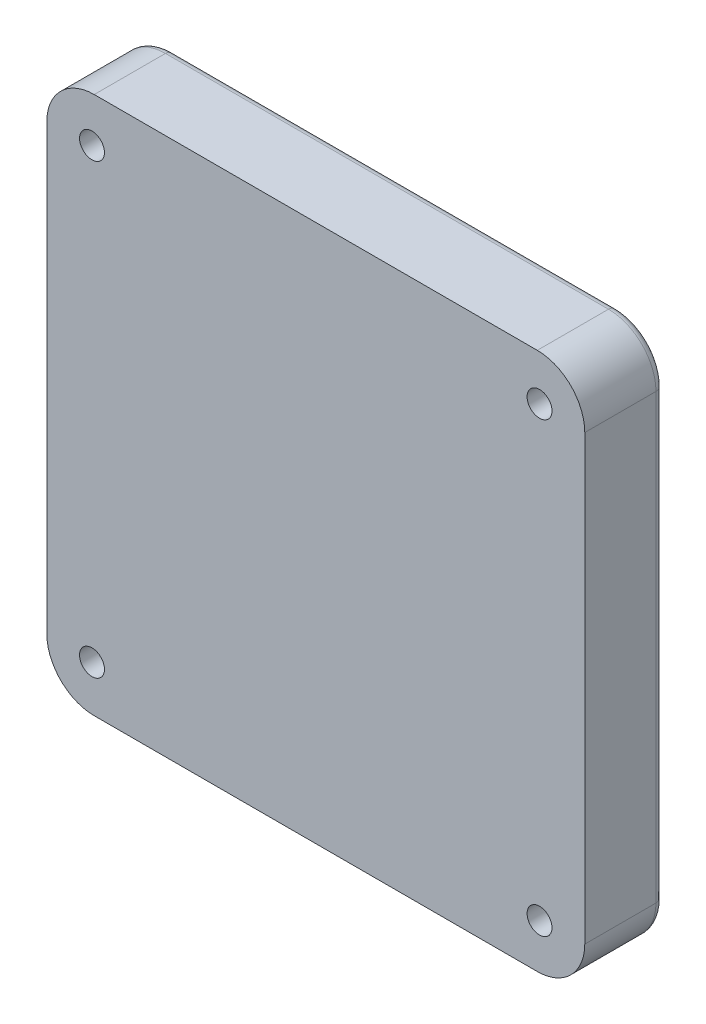
ISO-10303-21;
HEADER;
FILE_DESCRIPTION(('STEP AP214'),'2;1');
FILE_NAME('part.step','',(''),(''),'','','');
FILE_SCHEMA(('AUTOMOTIVE_DESIGN { 1 0 10303 214 1 1 1 1 }'));
ENDSEC;
DATA;
#1=APPLICATION_CONTEXT('core data for automotive mechanical design processes');
#2=APPLICATION_PROTOCOL_DEFINITION('international standard','automotive_design',2000,#1);
#3=PRODUCT_CONTEXT('',#1,'mechanical');
#4=PRODUCT('Part','Part','',(#3));
#5=PRODUCT_RELATED_PRODUCT_CATEGORY('part','',(#4));
#6=PRODUCT_DEFINITION_FORMATION('','',#4);
#7=PRODUCT_DEFINITION_CONTEXT('part definition',#1,'design');
#8=PRODUCT_DEFINITION('design','',#6,#7);
#9=PRODUCT_DEFINITION_SHAPE('','',#8);
#10=(LENGTH_UNIT() NAMED_UNIT(*) SI_UNIT(.MILLI.,.METRE.));
#11=(NAMED_UNIT(*) PLANE_ANGLE_UNIT() SI_UNIT($,.RADIAN.));
#12=(NAMED_UNIT(*) SI_UNIT($,.STERADIAN.) SOLID_ANGLE_UNIT());
#13=UNCERTAINTY_MEASURE_WITH_UNIT(LENGTH_MEASURE(1.E-05),#10,'distance_accuracy_value','');
#14=(GEOMETRIC_REPRESENTATION_CONTEXT(3) GLOBAL_UNCERTAINTY_ASSIGNED_CONTEXT((#13)) GLOBAL_UNIT_ASSIGNED_CONTEXT((#10,
#11,#12)) REPRESENTATION_CONTEXT('',''));
#15=CARTESIAN_POINT('',(0.,0.,0.));
#16=DIRECTION('',(0.,0.,1.));
#17=DIRECTION('',(1.,0.,0.));
#18=AXIS2_PLACEMENT_3D('',#15,#16,#17);
#19=CARTESIAN_POINT('',(117.072792821185,19.2587083204985,-106.995840518768));
#20=DIRECTION('',(0.,0.,1.));
#21=DIRECTION('',(1.,0.,0.));
#22=AXIS2_PLACEMENT_3D('',#19,#20,#21);
#23=PLANE('',#22);
#24=DIRECTION('',(1.,0.,0.));
#25=VECTOR('',#24,1.);
#26=CARTESIAN_POINT('',(117.072792821185,80.2587083204985,-106.995840518768));
#27=LINE('',#26,#25);
#28=CARTESIAN_POINT('',(61.0727928211846,80.2587083204985,-106.995840518768));
#29=VERTEX_POINT('',#28);
#30=CARTESIAN_POINT('',(117.072792821185,80.2587083204985,-106.995840518768));
#31=VERTEX_POINT('',#30);
#32=EDGE_CURVE('E197',#29,#31,#27,.T.);
#33=ORIENTED_EDGE('',*,*,#32,.T.);
#34=CARTESIAN_POINT('',(117.072792821185,75.2587083204985,-106.995840518768));
#35=DIRECTION('',(0.,0.,1.));
#36=DIRECTION('',(1.,0.,0.));
#37=AXIS2_PLACEMENT_3D('',#34,#35,#36);
#38=CIRCLE('',#37,5.);
#39=CARTESIAN_POINT('',(122.072792821185,75.2587083204985,-106.995840518768));
#40=VERTEX_POINT('',#39);
#41=EDGE_CURVE('E199',#31,#40,#38,.F.);
#42=ORIENTED_EDGE('',*,*,#41,.T.);
#43=DIRECTION('',(0.,-1.,0.));
#44=VECTOR('',#43,1.);
#45=CARTESIAN_POINT('',(122.072792821185,19.2587083204985,-106.995840518768));
#46=LINE('',#45,#44);
#47=CARTESIAN_POINT('',(122.072792821185,19.2587083204985,-106.995840518768));
#48=VERTEX_POINT('',#47);
#49=EDGE_CURVE('E136',#40,#48,#46,.T.);
#50=ORIENTED_EDGE('',*,*,#49,.T.);
#51=CARTESIAN_POINT('',(117.072792821185,19.2587083204985,-106.995840518768));
#52=DIRECTION('',(0.,0.,1.));
#53=DIRECTION('',(1.,0.,0.));
#54=AXIS2_PLACEMENT_3D('',#51,#52,#53);
#55=CIRCLE('',#54,5.);
#56=CARTESIAN_POINT('',(117.072792821185,14.2587083204985,-106.995840518768));
#57=VERTEX_POINT('',#56);
#58=EDGE_CURVE('E187',#48,#57,#55,.F.);
#59=ORIENTED_EDGE('',*,*,#58,.T.);
#60=DIRECTION('',(-1.,0.,0.));
#61=VECTOR('',#60,1.);
#62=CARTESIAN_POINT('',(117.072792821185,14.2587083204985,-106.995840518768));
#63=LINE('',#62,#61);
#64=CARTESIAN_POINT('',(61.0727928211846,14.2587083204985,-106.995840518768));
#65=VERTEX_POINT('',#64);
#66=EDGE_CURVE('E189',#57,#65,#63,.T.);
#67=ORIENTED_EDGE('',*,*,#66,.T.);
#68=CARTESIAN_POINT('',(61.0727928211845,19.2587083204985,-106.995840518768));
#69=DIRECTION('',(0.,0.,1.));
#70=DIRECTION('',(1.,0.,0.));
#71=AXIS2_PLACEMENT_3D('',#68,#69,#70);
#72=CIRCLE('',#71,5.);
#73=CARTESIAN_POINT('',(56.0727928211845,19.2587083204985,-106.995840518768));
#74=VERTEX_POINT('',#73);
#75=EDGE_CURVE('E191',#65,#74,#72,.F.);
#76=ORIENTED_EDGE('',*,*,#75,.T.);
#77=DIRECTION('',(0.,1.,0.));
#78=VECTOR('',#77,1.);
#79=CARTESIAN_POINT('',(56.0727928211845,19.2587083204985,-106.995840518768));
#80=LINE('',#79,#78);
#81=CARTESIAN_POINT('',(56.0727928211845,75.2587083204985,-106.995840518768));
#82=VERTEX_POINT('',#81);
#83=EDGE_CURVE('E193',#74,#82,#80,.T.);
#84=ORIENTED_EDGE('',*,*,#83,.T.);
#85=CARTESIAN_POINT('',(61.0727928211845,75.2587083204985,-106.995840518768));
#86=DIRECTION('',(0.,0.,1.));
#87=DIRECTION('',(1.,0.,0.));
#88=AXIS2_PLACEMENT_3D('',#85,#86,#87);
#89=CIRCLE('',#88,5.);
#90=EDGE_CURVE('E195',#82,#29,#89,.F.);
#91=ORIENTED_EDGE('',*,*,#90,.T.);
#92=EDGE_LOOP('',(#33,#42,#50,#59,#67,#76,#84,#91));
#93=FACE_BOUND('',#92,.T.);
#94=CARTESIAN_POINT('',(117.357064068646,75.5429795679604,-106.995840518768));
#95=DIRECTION('',(0.,0.,-1.));
#96=DIRECTION('',(-1.,0.,0.));
#97=AXIS2_PLACEMENT_3D('',#94,#95,#96);
#98=CIRCLE('',#97,1.57499999999999);
#99=CARTESIAN_POINT('',(115.782064068646,75.5429795679604,-106.995840518768));
#100=VERTEX_POINT('',#99);
#101=EDGE_CURVE('E152',#100,#100,#98,.T.);
#102=ORIENTED_EDGE('',*,*,#101,.F.);
#103=EDGE_LOOP('',(#102));
#104=FACE_BOUND('',#103,.T.);
#105=CARTESIAN_POINT('',(60.7885215737225,75.5429795679611,-106.995840518768));
#106=DIRECTION('',(0.,0.,-1.));
#107=DIRECTION('',(-1.,0.,0.));
#108=AXIS2_PLACEMENT_3D('',#105,#106,#107);
#109=CIRCLE('',#108,1.57499999999999);
#110=CARTESIAN_POINT('',(59.2135215737225,75.5429795679611,-106.995840518768));
#111=VERTEX_POINT('',#110);
#112=EDGE_CURVE('E256',#111,#111,#109,.T.);
#113=ORIENTED_EDGE('',*,*,#112,.F.);
#114=EDGE_LOOP('',(#113));
#115=FACE_BOUND('',#114,.T.);
#116=CARTESIAN_POINT('',(60.788521573722,18.9744370730372,-106.995840518768));
#117=DIRECTION('',(0.,0.,-1.));
#118=DIRECTION('',(-1.,0.,0.));
#119=AXIS2_PLACEMENT_3D('',#116,#117,#118);
#120=CIRCLE('',#119,1.57499999999999);
#121=CARTESIAN_POINT('',(59.213521573722,18.9744370730372,-106.995840518768));
#122=VERTEX_POINT('',#121);
#123=EDGE_CURVE('E250',#122,#122,#120,.T.);
#124=ORIENTED_EDGE('',*,*,#123,.F.);
#125=EDGE_LOOP('',(#124));
#126=FACE_BOUND('',#125,.T.);
#127=CARTESIAN_POINT('',(117.357064068646,18.9744370730369,-106.995840518768));
#128=DIRECTION('',(0.,0.,-1.));
#129=DIRECTION('',(-1.,0.,0.));
#130=AXIS2_PLACEMENT_3D('',#127,#128,#129);
#131=CIRCLE('',#130,1.57499999999998);
#132=CARTESIAN_POINT('',(115.782064068646,18.9744370730369,-106.995840518768));
#133=VERTEX_POINT('',#132);
#134=EDGE_CURVE('E242',#133,#133,#131,.T.);
#135=ORIENTED_EDGE('',*,*,#134,.F.);
#136=EDGE_LOOP('',(#135));
#137=FACE_BOUND('',#136,.T.);
#138=ADVANCED_FACE('F41',(#93,#104,#115,#126,#137),#23,.F.);
#139=CARTESIAN_POINT('',(117.072792821185,19.2587083204985,-96.9958405187684));
#140=DIRECTION('',(0.,0.,1.));
#141=DIRECTION('',(1.,0.,0.));
#142=AXIS2_PLACEMENT_3D('',#139,#140,#141);
#143=PLANE('',#142);
#144=CARTESIAN_POINT('',(60.788521573722,18.9744370730372,-96.9958405187684));
#145=DIRECTION('',(0.,0.,-1.));
#146=DIRECTION('',(-1.,0.,0.));
#147=AXIS2_PLACEMENT_3D('',#144,#145,#146);
#148=CIRCLE('',#147,1.57499999999999);
#149=CARTESIAN_POINT('',(59.213521573722,18.9744370730372,-96.9958405187684));
#150=VERTEX_POINT('',#149);
#151=EDGE_CURVE('E247',#150,#150,#148,.T.);
#152=ORIENTED_EDGE('',*,*,#151,.T.);
#153=EDGE_LOOP('',(#152));
#154=FACE_BOUND('',#153,.T.);
#155=CARTESIAN_POINT('',(117.357064068646,75.5429795679604,-96.9958405187684));
#156=DIRECTION('',(0.,0.,-1.));
#157=DIRECTION('',(-1.,0.,0.));
#158=AXIS2_PLACEMENT_3D('',#155,#156,#157);
#159=CIRCLE('',#158,1.57499999999999);
#160=CARTESIAN_POINT('',(115.782064068646,75.5429795679604,-96.9958405187684));
#161=VERTEX_POINT('',#160);
#162=EDGE_CURVE('E155',#161,#161,#159,.T.);
#163=ORIENTED_EDGE('',*,*,#162,.T.);
#164=EDGE_LOOP('',(#163));
#165=FACE_BOUND('',#164,.T.);
#166=CARTESIAN_POINT('',(117.072792821185,19.2587083204985,-96.9958405187684));
#167=DIRECTION('',(0.,0.,-1.));
#168=DIRECTION('',(1.,0.,0.));
#169=AXIS2_PLACEMENT_3D('',#166,#167,#168);
#170=CIRCLE('',#169,6.);
#171=CARTESIAN_POINT('',(123.072792821185,19.2587083204985,-96.9958405187684));
#172=VERTEX_POINT('',#171);
#173=CARTESIAN_POINT('',(117.072792821185,13.2587083204985,-96.9958405187684));
#174=VERTEX_POINT('',#173);
#175=EDGE_CURVE('E144',#172,#174,#170,.T.);
#176=ORIENTED_EDGE('',*,*,#175,.F.);
#177=DIRECTION('',(0.,-1.,0.));
#178=VECTOR('',#177,1.);
#179=CARTESIAN_POINT('',(123.072792821185,19.2587083204985,-96.9958405187684));
#180=LINE('',#179,#178);
#181=CARTESIAN_POINT('',(123.072792821185,75.2587083204984,-96.9958405187684));
#182=VERTEX_POINT('',#181);
#183=EDGE_CURVE('E172',#182,#172,#180,.T.);
#184=ORIENTED_EDGE('',*,*,#183,.F.);
#185=CARTESIAN_POINT('',(117.072792821185,75.2587083204985,-96.9958405187684));
#186=DIRECTION('',(0.,0.,-1.));
#187=DIRECTION('',(-1.,0.,0.));
#188=AXIS2_PLACEMENT_3D('',#185,#186,#187);
#189=CIRCLE('',#188,6.);
#190=CARTESIAN_POINT('',(117.072792821185,81.2587083204985,-96.9958405187684));
#191=VERTEX_POINT('',#190);
#192=EDGE_CURVE('E169',#191,#182,#189,.T.);
#193=ORIENTED_EDGE('',*,*,#192,.F.);
#194=DIRECTION('',(1.,0.,0.));
#195=VECTOR('',#194,1.);
#196=CARTESIAN_POINT('',(61.0727928211846,81.2587083204985,-96.9958405187684));
#197=LINE('',#196,#195);
#198=CARTESIAN_POINT('',(61.0727928211846,81.2587083204985,-96.9958405187684));
#199=VERTEX_POINT('',#198);
#200=EDGE_CURVE('E166',#199,#191,#197,.T.);
#201=ORIENTED_EDGE('',*,*,#200,.F.);
#202=CARTESIAN_POINT('',(61.0727928211845,75.2587083204985,-96.9958405187684));
#203=DIRECTION('',(0.,0.,-1.));
#204=DIRECTION('',(-1.,0.,0.));
#205=AXIS2_PLACEMENT_3D('',#202,#203,#204);
#206=CIRCLE('',#205,6.);
#207=CARTESIAN_POINT('',(55.0727928211845,75.2587083204985,-96.9958405187684));
#208=VERTEX_POINT('',#207);
#209=EDGE_CURVE('E163',#208,#199,#206,.T.);
#210=ORIENTED_EDGE('',*,*,#209,.F.);
#211=DIRECTION('',(0.,1.,0.));
#212=VECTOR('',#211,1.);
#213=CARTESIAN_POINT('',(55.0727928211845,19.2587083204985,-96.9958405187684));
#214=LINE('',#213,#212);
#215=CARTESIAN_POINT('',(55.0727928211845,19.2587083204985,-96.9958405187684));
#216=VERTEX_POINT('',#215);
#217=EDGE_CURVE('E160',#216,#208,#214,.T.);
#218=ORIENTED_EDGE('',*,*,#217,.F.);
#219=CARTESIAN_POINT('',(61.0727928211845,19.2587083204985,-96.9958405187684));
#220=DIRECTION('',(0.,0.,-1.));
#221=DIRECTION('',(-1.,0.,0.));
#222=AXIS2_PLACEMENT_3D('',#219,#220,#221);
#223=CIRCLE('',#222,6.);
#224=CARTESIAN_POINT('',(61.0727928211846,13.2587083204985,-96.9958405187684));
#225=VERTEX_POINT('',#224);
#226=EDGE_CURVE('E147',#225,#216,#223,.T.);
#227=ORIENTED_EDGE('',*,*,#226,.F.);
#228=DIRECTION('',(-1.,0.,0.));
#229=VECTOR('',#228,1.);
#230=CARTESIAN_POINT('',(61.0727928211846,13.2587083204985,-96.9958405187684));
#231=LINE('',#230,#229);
#232=EDGE_CURVE('E132',#174,#225,#231,.T.);
#233=ORIENTED_EDGE('',*,*,#232,.F.);
#234=EDGE_LOOP('',(#176,#184,#193,#201,#210,#218,#227,#233));
#235=FACE_BOUND('',#234,.T.);
#236=CARTESIAN_POINT('',(60.7885215737225,75.5429795679611,-96.9958405187684));
#237=DIRECTION('',(0.,0.,-1.));
#238=DIRECTION('',(-1.,0.,0.));
#239=AXIS2_PLACEMENT_3D('',#236,#237,#238);
#240=CIRCLE('',#239,1.57499999999999);
#241=CARTESIAN_POINT('',(59.2135215737225,75.5429795679611,-96.9958405187684));
#242=VERTEX_POINT('',#241);
#243=EDGE_CURVE('E253',#242,#242,#240,.T.);
#244=ORIENTED_EDGE('',*,*,#243,.T.);
#245=EDGE_LOOP('',(#244));
#246=FACE_BOUND('',#245,.T.);
#247=CARTESIAN_POINT('',(117.357064068646,18.9744370730369,-96.9958405187684));
#248=DIRECTION('',(0.,0.,-1.));
#249=DIRECTION('',(-1.,0.,0.));
#250=AXIS2_PLACEMENT_3D('',#247,#248,#249);
#251=CIRCLE('',#250,1.57499999999998);
#252=CARTESIAN_POINT('',(115.782064068646,18.9744370730369,-96.9958405187684));
#253=VERTEX_POINT('',#252);
#254=EDGE_CURVE('E236',#253,#253,#251,.T.);
#255=ORIENTED_EDGE('',*,*,#254,.T.);
#256=EDGE_LOOP('',(#255));
#257=FACE_BOUND('',#256,.T.);
#258=ADVANCED_FACE('F141',(#154,#165,#235,#246,#257),#143,.T.);
#259=CARTESIAN_POINT('',(117.072792821185,19.2587083204985,-106.995840518768));
#260=DIRECTION('',(0.,0.,1.));
#261=DIRECTION('',(1.,0.,0.));
#262=AXIS2_PLACEMENT_3D('',#259,#260,#261);
#263=CYLINDRICAL_SURFACE('',#262,6.);
#264=DIRECTION('',(0.,0.,1.));
#265=VECTOR('',#264,1.);
#266=CARTESIAN_POINT('',(117.072792821185,13.2587083204985,-106.995840518768));
#267=LINE('',#266,#265);
#268=CARTESIAN_POINT('',(117.072792821185,13.2587083204985,-105.995840518768));
#269=VERTEX_POINT('',#268);
#270=EDGE_CURVE('E129',#269,#174,#267,.T.);
#271=ORIENTED_EDGE('',*,*,#270,.F.);
#272=CARTESIAN_POINT('',(117.072792821185,19.2587083204985,-105.995840518768));
#273=DIRECTION('',(0.,0.,1.));
#274=DIRECTION('',(1.,0.,0.));
#275=AXIS2_PLACEMENT_3D('',#272,#273,#274);
#276=CIRCLE('',#275,6.);
#277=CARTESIAN_POINT('',(123.072792821185,19.2587083204985,-105.995840518768));
#278=VERTEX_POINT('',#277);
#279=EDGE_CURVE('E50',#269,#278,#276,.T.);
#280=ORIENTED_EDGE('',*,*,#279,.T.);
#281=DIRECTION('',(0.,0.,1.));
#282=VECTOR('',#281,1.);
#283=CARTESIAN_POINT('',(123.072792821185,19.2587083204985,-106.995840518768));
#284=LINE('',#283,#282);
#285=EDGE_CURVE('E150',#278,#172,#284,.T.);
#286=ORIENTED_EDGE('',*,*,#285,.T.);
#287=ORIENTED_EDGE('',*,*,#175,.T.);
#288=EDGE_LOOP('',(#271,#280,#286,#287));
#289=FACE_BOUND('',#288,.T.);
#290=ADVANCED_FACE('F149',(#289),#263,.T.);
#291=CARTESIAN_POINT('',(61.0727928211846,13.2587083204985,-106.995840518768));
#292=DIRECTION('',(0.,1.,0.));
#293=DIRECTION('',(-1.,0.,0.));
#294=AXIS2_PLACEMENT_3D('',#291,#292,#293);
#295=PLANE('',#294);
#296=DIRECTION('',(0.,0.,1.));
#297=VECTOR('',#296,1.);
#298=CARTESIAN_POINT('',(61.0727928211846,13.2587083204985,-106.995840518768));
#299=LINE('',#298,#297);
#300=CARTESIAN_POINT('',(61.0727928211846,13.2587083204985,-105.995840518768));
#301=VERTEX_POINT('',#300);
#302=EDGE_CURVE('E137',#301,#225,#299,.T.);
#303=ORIENTED_EDGE('',*,*,#302,.F.);
#304=DIRECTION('',(-1.,0.,0.));
#305=VECTOR('',#304,1.);
#306=CARTESIAN_POINT('',(61.0727928211846,13.2587083204985,-105.995840518768));
#307=LINE('',#306,#305);
#308=EDGE_CURVE('E65',#301,#269,#307,.F.);
#309=ORIENTED_EDGE('',*,*,#308,.T.);
#310=ORIENTED_EDGE('',*,*,#270,.T.);
#311=ORIENTED_EDGE('',*,*,#232,.T.);
#312=EDGE_LOOP('',(#303,#309,#310,#311));
#313=FACE_BOUND('',#312,.T.);
#314=ADVANCED_FACE('F131',(#313),#295,.F.);
#315=CARTESIAN_POINT('',(61.0727928211845,19.2587083204985,-106.995840518768));
#316=DIRECTION('',(0.,0.,1.));
#317=DIRECTION('',(1.,0.,0.));
#318=AXIS2_PLACEMENT_3D('',#315,#316,#317);
#319=CYLINDRICAL_SURFACE('',#318,6.);
#320=DIRECTION('',(0.,0.,1.));
#321=VECTOR('',#320,1.);
#322=CARTESIAN_POINT('',(55.0727928211845,19.2587083204985,-106.995840518768));
#323=LINE('',#322,#321);
#324=CARTESIAN_POINT('',(55.0727928211845,19.2587083204985,-105.995840518768));
#325=VERTEX_POINT('',#324);
#326=EDGE_CURVE('E183',#325,#216,#323,.T.);
#327=ORIENTED_EDGE('',*,*,#326,.F.);
#328=CARTESIAN_POINT('',(61.0727928211845,19.2587083204985,-105.995840518768));
#329=DIRECTION('',(0.,0.,1.));
#330=DIRECTION('',(1.,0.,0.));
#331=AXIS2_PLACEMENT_3D('',#328,#329,#330);
#332=CIRCLE('',#331,6.);
#333=EDGE_CURVE('E211',#325,#301,#332,.T.);
#334=ORIENTED_EDGE('',*,*,#333,.T.);
#335=ORIENTED_EDGE('',*,*,#302,.T.);
#336=ORIENTED_EDGE('',*,*,#226,.T.);
#337=EDGE_LOOP('',(#327,#334,#335,#336));
#338=FACE_BOUND('',#337,.T.);
#339=ADVANCED_FACE('F308',(#338),#319,.T.);
#340=CARTESIAN_POINT('',(55.0727928211845,19.2587083204985,-106.995840518768));
#341=DIRECTION('',(1.,0.,0.));
#342=DIRECTION('',(0.,0.,-1.));
#343=AXIS2_PLACEMENT_3D('',#340,#341,#342);
#344=PLANE('',#343);
#345=DIRECTION('',(0.,0.,1.));
#346=VECTOR('',#345,1.);
#347=CARTESIAN_POINT('',(55.0727928211845,75.2587083204985,-106.995840518768));
#348=LINE('',#347,#346);
#349=CARTESIAN_POINT('',(55.0727928211845,75.2587083204985,-105.995840518768));
#350=VERTEX_POINT('',#349);
#351=EDGE_CURVE('E181',#350,#208,#348,.T.);
#352=ORIENTED_EDGE('',*,*,#351,.F.);
#353=DIRECTION('',(0.,1.,0.));
#354=VECTOR('',#353,1.);
#355=CARTESIAN_POINT('',(55.0727928211845,19.2587083204985,-105.995840518768));
#356=LINE('',#355,#354);
#357=EDGE_CURVE('E209',#350,#325,#356,.F.);
#358=ORIENTED_EDGE('',*,*,#357,.T.);
#359=ORIENTED_EDGE('',*,*,#326,.T.);
#360=ORIENTED_EDGE('',*,*,#217,.T.);
#361=EDGE_LOOP('',(#352,#358,#359,#360));
#362=FACE_BOUND('',#361,.T.);
#363=ADVANCED_FACE('F304',(#362),#344,.F.);
#364=CARTESIAN_POINT('',(61.0727928211845,75.2587083204985,-106.995840518768));
#365=DIRECTION('',(0.,0.,1.));
#366=DIRECTION('',(1.,0.,0.));
#367=AXIS2_PLACEMENT_3D('',#364,#365,#366);
#368=CYLINDRICAL_SURFACE('',#367,6.);
#369=DIRECTION('',(0.,0.,1.));
#370=VECTOR('',#369,1.);
#371=CARTESIAN_POINT('',(61.0727928211846,81.2587083204985,-106.995840518768));
#372=LINE('',#371,#370);
#373=CARTESIAN_POINT('',(61.0727928211846,81.2587083204985,-105.995840518768));
#374=VERTEX_POINT('',#373);
#375=EDGE_CURVE('E179',#374,#199,#372,.T.);
#376=ORIENTED_EDGE('',*,*,#375,.F.);
#377=CARTESIAN_POINT('',(61.0727928211845,75.2587083204985,-105.995840518768));
#378=DIRECTION('',(0.,0.,1.));
#379=DIRECTION('',(1.,0.,0.));
#380=AXIS2_PLACEMENT_3D('',#377,#378,#379);
#381=CIRCLE('',#380,6.);
#382=EDGE_CURVE('E207',#374,#350,#381,.T.);
#383=ORIENTED_EDGE('',*,*,#382,.T.);
#384=ORIENTED_EDGE('',*,*,#351,.T.);
#385=ORIENTED_EDGE('',*,*,#209,.T.);
#386=EDGE_LOOP('',(#376,#383,#384,#385));
#387=FACE_BOUND('',#386,.T.);
#388=ADVANCED_FACE('F300',(#387),#368,.T.);
#389=CARTESIAN_POINT('',(61.0727928211846,81.2587083204985,-106.995840518768));
#390=DIRECTION('',(0.,-1.,0.));
#391=DIRECTION('',(1.,0.,0.));
#392=AXIS2_PLACEMENT_3D('',#389,#390,#391);
#393=PLANE('',#392);
#394=DIRECTION('',(0.,0.,1.));
#395=VECTOR('',#394,1.);
#396=CARTESIAN_POINT('',(117.072792821185,81.2587083204985,-106.995840518768));
#397=LINE('',#396,#395);
#398=CARTESIAN_POINT('',(117.072792821185,81.2587083204985,-105.995840518768));
#399=VERTEX_POINT('',#398);
#400=EDGE_CURVE('E177',#399,#191,#397,.T.);
#401=ORIENTED_EDGE('',*,*,#400,.F.);
#402=DIRECTION('',(1.,0.,0.));
#403=VECTOR('',#402,1.);
#404=CARTESIAN_POINT('',(61.0727928211846,81.2587083204985,-105.995840518768));
#405=LINE('',#404,#403);
#406=EDGE_CURVE('E205',#399,#374,#405,.F.);
#407=ORIENTED_EDGE('',*,*,#406,.T.);
#408=ORIENTED_EDGE('',*,*,#375,.T.);
#409=ORIENTED_EDGE('',*,*,#200,.T.);
#410=EDGE_LOOP('',(#401,#407,#408,#409));
#411=FACE_BOUND('',#410,.T.);
#412=ADVANCED_FACE('F296',(#411),#393,.F.);
#413=CARTESIAN_POINT('',(117.072792821185,75.2587083204985,-106.995840518768));
#414=DIRECTION('',(0.,0.,1.));
#415=DIRECTION('',(1.,0.,0.));
#416=AXIS2_PLACEMENT_3D('',#413,#414,#415);
#417=CYLINDRICAL_SURFACE('',#416,6.);
#418=DIRECTION('',(0.,0.,1.));
#419=VECTOR('',#418,1.);
#420=CARTESIAN_POINT('',(123.072792821185,75.2587083204984,-106.995840518768));
#421=LINE('',#420,#419);
#422=CARTESIAN_POINT('',(123.072792821185,75.2587083204984,-105.995840518768));
#423=VERTEX_POINT('',#422);
#424=EDGE_CURVE('E175',#423,#182,#421,.T.);
#425=ORIENTED_EDGE('',*,*,#424,.F.);
#426=CARTESIAN_POINT('',(117.072792821185,75.2587083204985,-105.995840518768));
#427=DIRECTION('',(0.,0.,1.));
#428=DIRECTION('',(1.,0.,0.));
#429=AXIS2_PLACEMENT_3D('',#426,#427,#428);
#430=CIRCLE('',#429,6.);
#431=EDGE_CURVE('E202',#423,#399,#430,.T.);
#432=ORIENTED_EDGE('',*,*,#431,.T.);
#433=ORIENTED_EDGE('',*,*,#400,.T.);
#434=ORIENTED_EDGE('',*,*,#192,.T.);
#435=EDGE_LOOP('',(#425,#432,#433,#434));
#436=FACE_BOUND('',#435,.T.);
#437=ADVANCED_FACE('F292',(#436),#417,.T.);
#438=CARTESIAN_POINT('',(123.072792821185,19.2587083204985,-106.995840518768));
#439=DIRECTION('',(-1.,0.,0.));
#440=DIRECTION('',(0.,0.,1.));
#441=AXIS2_PLACEMENT_3D('',#438,#439,#440);
#442=PLANE('',#441);
#443=ORIENTED_EDGE('',*,*,#285,.F.);
#444=DIRECTION('',(0.,-1.,0.));
#445=VECTOR('',#444,1.);
#446=CARTESIAN_POINT('',(123.072792821185,19.2587083204985,-105.995840518768));
#447=LINE('',#446,#445);
#448=EDGE_CURVE('E11',#278,#423,#447,.F.);
#449=ORIENTED_EDGE('',*,*,#448,.T.);
#450=ORIENTED_EDGE('',*,*,#424,.T.);
#451=ORIENTED_EDGE('',*,*,#183,.T.);
#452=EDGE_LOOP('',(#443,#449,#450,#451));
#453=FACE_BOUND('',#452,.T.);
#454=ADVANCED_FACE('F275',(#453),#442,.F.);
#455=CARTESIAN_POINT('',(117.357064068646,75.5429795679604,-106.995840518768));
#456=DIRECTION('',(0.,0.,1.));
#457=DIRECTION('',(1.,0.,0.));
#458=AXIS2_PLACEMENT_3D('',#455,#456,#457);
#459=CYLINDRICAL_SURFACE('',#458,1.57499999999999);
#460=ORIENTED_EDGE('',*,*,#101,.T.);
#461=EDGE_LOOP('',(#460));
#462=FACE_BOUND('',#461,.T.);
#463=ORIENTED_EDGE('',*,*,#162,.F.);
#464=EDGE_LOOP('',(#463));
#465=FACE_BOUND('',#464,.T.);
#466=ADVANCED_FACE('F265',(#462,#465),#459,.F.);
#467=CARTESIAN_POINT('',(60.7885215737225,75.5429795679611,-106.995840518768));
#468=DIRECTION('',(0.,0.,1.));
#469=DIRECTION('',(1.,0.,0.));
#470=AXIS2_PLACEMENT_3D('',#467,#468,#469);
#471=CYLINDRICAL_SURFACE('',#470,1.57499999999999);
#472=ORIENTED_EDGE('',*,*,#112,.T.);
#473=EDGE_LOOP('',(#472));
#474=FACE_BOUND('',#473,.T.);
#475=ORIENTED_EDGE('',*,*,#243,.F.);
#476=EDGE_LOOP('',(#475));
#477=FACE_BOUND('',#476,.T.);
#478=ADVANCED_FACE('F262',(#474,#477),#471,.F.);
#479=CARTESIAN_POINT('',(60.788521573722,18.9744370730372,-106.995840518768));
#480=DIRECTION('',(0.,0.,1.));
#481=DIRECTION('',(1.,0.,0.));
#482=AXIS2_PLACEMENT_3D('',#479,#480,#481);
#483=CYLINDRICAL_SURFACE('',#482,1.57499999999999);
#484=ORIENTED_EDGE('',*,*,#123,.T.);
#485=EDGE_LOOP('',(#484));
#486=FACE_BOUND('',#485,.T.);
#487=ORIENTED_EDGE('',*,*,#151,.F.);
#488=EDGE_LOOP('',(#487));
#489=FACE_BOUND('',#488,.T.);
#490=ADVANCED_FACE('F264',(#486,#489),#483,.F.);
#491=CARTESIAN_POINT('',(117.357064068646,18.9744370730369,-106.995840518768));
#492=DIRECTION('',(0.,0.,1.));
#493=DIRECTION('',(1.,0.,0.));
#494=AXIS2_PLACEMENT_3D('',#491,#492,#493);
#495=CYLINDRICAL_SURFACE('',#494,1.57499999999998);
#496=ORIENTED_EDGE('',*,*,#134,.T.);
#497=EDGE_LOOP('',(#496));
#498=FACE_BOUND('',#497,.T.);
#499=ORIENTED_EDGE('',*,*,#254,.F.);
#500=EDGE_LOOP('',(#499));
#501=FACE_BOUND('',#500,.T.);
#502=ADVANCED_FACE('F272',(#498,#501),#495,.F.);
#503=CARTESIAN_POINT('',(61.0727928211845,19.2587083204985,-105.995840518768));
#504=DIRECTION('',(0.,0.,1.));
#505=DIRECTION('',(1.,0.,0.));
#506=AXIS2_PLACEMENT_3D('',#503,#504,#505);
#507=TOROIDAL_SURFACE('',#506,5.,1.);
#508=CARTESIAN_POINT('',(61.0727928211846,14.2587083204985,-105.995840518768));
#509=DIRECTION('',(1.,0.,0.));
#510=DIRECTION('',(0.,1.,0.));
#511=AXIS2_PLACEMENT_3D('',#508,#509,#510);
#512=CIRCLE('',#511,1.);
#513=EDGE_CURVE('E230',#301,#65,#512,.T.);
#514=ORIENTED_EDGE('',*,*,#513,.F.);
#515=ORIENTED_EDGE('',*,*,#333,.F.);
#516=CARTESIAN_POINT('',(56.0727928211845,19.2587083204985,-105.995840518768));
#517=DIRECTION('',(0.,1.,0.));
#518=DIRECTION('',(0.,0.,1.));
#519=AXIS2_PLACEMENT_3D('',#516,#517,#518);
#520=CIRCLE('',#519,1.);
#521=EDGE_CURVE('E45',#74,#325,#520,.T.);
#522=ORIENTED_EDGE('',*,*,#521,.F.);
#523=ORIENTED_EDGE('',*,*,#75,.F.);
#524=EDGE_LOOP('',(#514,#515,#522,#523));
#525=FACE_BOUND('',#524,.T.);
#526=ADVANCED_FACE('F43',(#525),#507,.T.);
#527=CARTESIAN_POINT('',(56.0727928211845,19.2587083204985,-105.995840518768));
#528=DIRECTION('',(0.,1.,0.));
#529=DIRECTION('',(0.,0.,1.));
#530=AXIS2_PLACEMENT_3D('',#527,#528,#529);
#531=CYLINDRICAL_SURFACE('',#530,1.);
#532=ORIENTED_EDGE('',*,*,#521,.T.);
#533=ORIENTED_EDGE('',*,*,#357,.F.);
#534=CARTESIAN_POINT('',(56.0727928211845,75.2587083204985,-105.995840518768));
#535=DIRECTION('',(0.,1.,0.));
#536=DIRECTION('',(-1.,0.,0.));
#537=AXIS2_PLACEMENT_3D('',#534,#535,#536);
#538=CIRCLE('',#537,1.);
#539=EDGE_CURVE('E228',#82,#350,#538,.T.);
#540=ORIENTED_EDGE('',*,*,#539,.F.);
#541=ORIENTED_EDGE('',*,*,#83,.F.);
#542=EDGE_LOOP('',(#532,#533,#540,#541));
#543=FACE_BOUND('',#542,.T.);
#544=ADVANCED_FACE('F338',(#543),#531,.T.);
#545=CARTESIAN_POINT('',(117.072792821185,14.2587083204985,-105.995840518768));
#546=DIRECTION('',(-1.,0.,0.));
#547=DIRECTION('',(0.,-1.,0.));
#548=AXIS2_PLACEMENT_3D('',#545,#546,#547);
#549=CYLINDRICAL_SURFACE('',#548,1.);
#550=ORIENTED_EDGE('',*,*,#513,.T.);
#551=ORIENTED_EDGE('',*,*,#66,.F.);
#552=CARTESIAN_POINT('',(117.072792821185,14.2587083204985,-105.995840518768));
#553=DIRECTION('',(1.,0.,0.));
#554=DIRECTION('',(0.,0.,-1.));
#555=AXIS2_PLACEMENT_3D('',#552,#553,#554);
#556=CIRCLE('',#555,1.);
#557=EDGE_CURVE('E225',#269,#57,#556,.T.);
#558=ORIENTED_EDGE('',*,*,#557,.F.);
#559=ORIENTED_EDGE('',*,*,#308,.F.);
#560=EDGE_LOOP('',(#550,#551,#558,#559));
#561=FACE_BOUND('',#560,.T.);
#562=ADVANCED_FACE('F335',(#561),#549,.T.);
#563=CARTESIAN_POINT('',(61.0727928211845,75.2587083204985,-105.995840518768));
#564=DIRECTION('',(0.,0.,1.));
#565=DIRECTION('',(1.,0.,0.));
#566=AXIS2_PLACEMENT_3D('',#563,#564,#565);
#567=TOROIDAL_SURFACE('',#566,5.,1.);
#568=ORIENTED_EDGE('',*,*,#539,.T.);
#569=ORIENTED_EDGE('',*,*,#382,.F.);
#570=CARTESIAN_POINT('',(61.0727928211846,80.2587083204985,-105.995840518768));
#571=DIRECTION('',(1.,0.,0.));
#572=DIRECTION('',(0.,0.,-1.));
#573=AXIS2_PLACEMENT_3D('',#570,#571,#572);
#574=CIRCLE('',#573,1.);
#575=EDGE_CURVE('E222',#29,#374,#574,.T.);
#576=ORIENTED_EDGE('',*,*,#575,.F.);
#577=ORIENTED_EDGE('',*,*,#90,.F.);
#578=EDGE_LOOP('',(#568,#569,#576,#577));
#579=FACE_BOUND('',#578,.T.);
#580=ADVANCED_FACE('F331',(#579),#567,.T.);
#581=CARTESIAN_POINT('',(117.072792821185,19.2587083204985,-105.995840518768));
#582=DIRECTION('',(0.,0.,1.));
#583=DIRECTION('',(1.,0.,0.));
#584=AXIS2_PLACEMENT_3D('',#581,#582,#583);
#585=TOROIDAL_SURFACE('',#584,5.,1.);
#586=ORIENTED_EDGE('',*,*,#557,.T.);
#587=ORIENTED_EDGE('',*,*,#58,.F.);
#588=CARTESIAN_POINT('',(122.072792821185,19.2587083204985,-105.995840518768));
#589=DIRECTION('',(0.,1.,0.));
#590=DIRECTION('',(-1.,0.,0.));
#591=AXIS2_PLACEMENT_3D('',#588,#589,#590);
#592=CIRCLE('',#591,1.);
#593=EDGE_CURVE('E219',#278,#48,#592,.T.);
#594=ORIENTED_EDGE('',*,*,#593,.F.);
#595=ORIENTED_EDGE('',*,*,#279,.F.);
#596=EDGE_LOOP('',(#586,#587,#594,#595));
#597=FACE_BOUND('',#596,.T.);
#598=ADVANCED_FACE('F327',(#597),#585,.T.);
#599=CARTESIAN_POINT('',(117.072792821185,80.2587083204985,-105.995840518768));
#600=DIRECTION('',(1.,0.,0.));
#601=DIRECTION('',(0.,1.,0.));
#602=AXIS2_PLACEMENT_3D('',#599,#600,#601);
#603=CYLINDRICAL_SURFACE('',#602,1.);
#604=ORIENTED_EDGE('',*,*,#575,.T.);
#605=ORIENTED_EDGE('',*,*,#406,.F.);
#606=CARTESIAN_POINT('',(117.072792821185,80.2587083204985,-105.995840518768));
#607=DIRECTION('',(1.,0.,0.));
#608=DIRECTION('',(0.,1.,0.));
#609=AXIS2_PLACEMENT_3D('',#606,#607,#608);
#610=CIRCLE('',#609,1.);
#611=EDGE_CURVE('E217',#31,#399,#610,.T.);
#612=ORIENTED_EDGE('',*,*,#611,.F.);
#613=ORIENTED_EDGE('',*,*,#32,.F.);
#614=EDGE_LOOP('',(#604,#605,#612,#613));
#615=FACE_BOUND('',#614,.T.);
#616=ADVANCED_FACE('F323',(#615),#603,.T.);
#617=CARTESIAN_POINT('',(122.072792821185,19.2587083204985,-105.995840518768));
#618=DIRECTION('',(0.,-1.,0.));
#619=DIRECTION('',(0.,0.,-1.));
#620=AXIS2_PLACEMENT_3D('',#617,#618,#619);
#621=CYLINDRICAL_SURFACE('',#620,1.);
#622=ORIENTED_EDGE('',*,*,#593,.T.);
#623=ORIENTED_EDGE('',*,*,#49,.F.);
#624=CARTESIAN_POINT('',(122.072792821185,75.2587083204984,-105.995840518768));
#625=DIRECTION('',(0.,1.,0.));
#626=DIRECTION('',(0.,0.,1.));
#627=AXIS2_PLACEMENT_3D('',#624,#625,#626);
#628=CIRCLE('',#627,1.);
#629=EDGE_CURVE('E215',#423,#40,#628,.T.);
#630=ORIENTED_EDGE('',*,*,#629,.F.);
#631=ORIENTED_EDGE('',*,*,#448,.F.);
#632=EDGE_LOOP('',(#622,#623,#630,#631));
#633=FACE_BOUND('',#632,.T.);
#634=ADVANCED_FACE('F319',(#633),#621,.T.);
#635=CARTESIAN_POINT('',(117.072792821185,75.2587083204985,-105.995840518768));
#636=DIRECTION('',(0.,0.,1.));
#637=DIRECTION('',(1.,0.,0.));
#638=AXIS2_PLACEMENT_3D('',#635,#636,#637);
#639=TOROIDAL_SURFACE('',#638,5.,1.);
#640=ORIENTED_EDGE('',*,*,#611,.T.);
#641=ORIENTED_EDGE('',*,*,#431,.F.);
#642=ORIENTED_EDGE('',*,*,#629,.T.);
#643=ORIENTED_EDGE('',*,*,#41,.F.);
#644=EDGE_LOOP('',(#640,#641,#642,#643));
#645=FACE_BOUND('',#644,.T.);
#646=ADVANCED_FACE('F316',(#645),#639,.T.);
#647=CLOSED_SHELL('',(#138,#258,#290,#314,#339,#363,#388,#412,#437,#454,#466,#478,#490,#502,
#526,#544,#562,#580,#598,#616,#634,#646));
#648=MANIFOLD_SOLID_BREP('B2',#647);
#649=ADVANCED_BREP_SHAPE_REPRESENTATION('',(#18,#648),#14);
#650=SHAPE_DEFINITION_REPRESENTATION(#9,#649);
ENDSEC;
END-ISO-10303-21;
